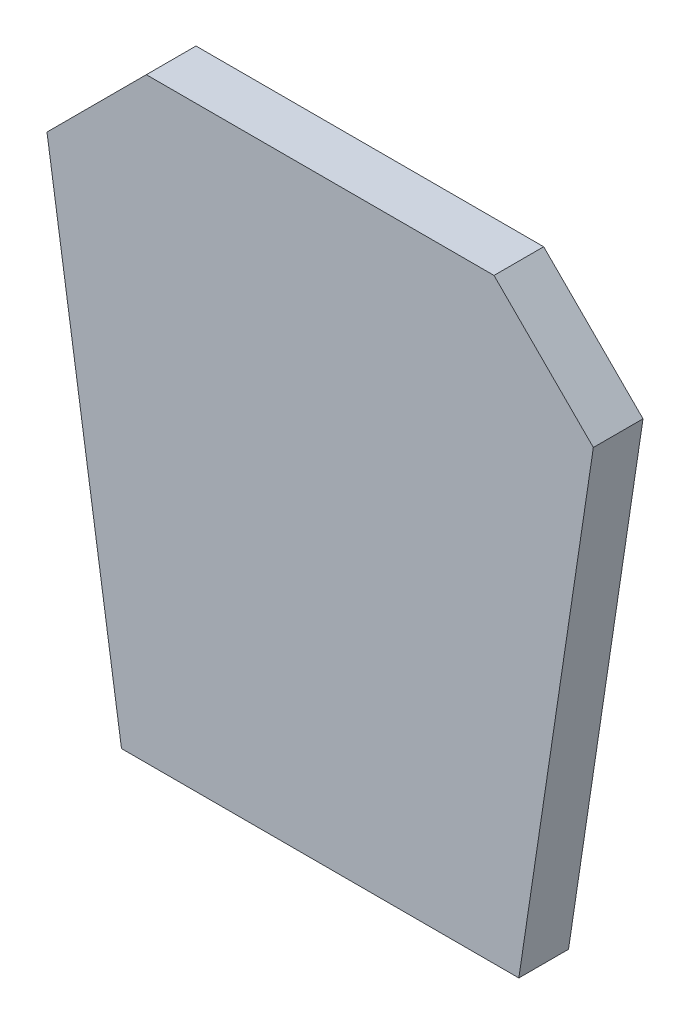
ISO-10303-21;
HEADER;
FILE_DESCRIPTION(('STEP AP214'),'2;1');
FILE_NAME('part.step','',(''),(''),'','','');
FILE_SCHEMA(('AUTOMOTIVE_DESIGN { 1 0 10303 214 1 1 1 1 }'));
ENDSEC;
DATA;
#1=APPLICATION_CONTEXT('core data for automotive mechanical design processes');
#2=APPLICATION_PROTOCOL_DEFINITION('international standard','automotive_design',2000,#1);
#3=PRODUCT_CONTEXT('',#1,'mechanical');
#4=PRODUCT('Part','Part','',(#3));
#5=PRODUCT_RELATED_PRODUCT_CATEGORY('part','',(#4));
#6=PRODUCT_DEFINITION_FORMATION('','',#4);
#7=PRODUCT_DEFINITION_CONTEXT('part definition',#1,'design');
#8=PRODUCT_DEFINITION('design','',#6,#7);
#9=PRODUCT_DEFINITION_SHAPE('','',#8);
#10=(LENGTH_UNIT() NAMED_UNIT(*) SI_UNIT(.MILLI.,.METRE.));
#11=(NAMED_UNIT(*) PLANE_ANGLE_UNIT() SI_UNIT($,.RADIAN.));
#12=(NAMED_UNIT(*) SI_UNIT($,.STERADIAN.) SOLID_ANGLE_UNIT());
#13=UNCERTAINTY_MEASURE_WITH_UNIT(LENGTH_MEASURE(1.E-05),#10,'distance_accuracy_value','');
#14=(GEOMETRIC_REPRESENTATION_CONTEXT(3) GLOBAL_UNCERTAINTY_ASSIGNED_CONTEXT((#13)) GLOBAL_UNIT_ASSIGNED_CONTEXT((#10,
#11,#12)) REPRESENTATION_CONTEXT('',''));
#15=CARTESIAN_POINT('',(0.,0.,0.));
#16=DIRECTION('',(0.,0.,1.));
#17=DIRECTION('',(1.,0.,0.));
#18=AXIS2_PLACEMENT_3D('',#15,#16,#17);
#19=CARTESIAN_POINT('',(-200.,0.,50.));
#20=DIRECTION('',(0.988936352868298,0.148340452930245,0.));
#21=DIRECTION('',(-0.148340452930245,0.988936352868298,0.));
#22=AXIS2_PLACEMENT_3D('',#19,#20,#21);
#23=PLANE('',#22);
#24=DIRECTION('',(0.148340452930245,-0.988936352868298,0.));
#25=VECTOR('',#24,1.);
#26=CARTESIAN_POINT('',(-200.,0.,0.));
#27=LINE('',#26,#25);
#28=CARTESIAN_POINT('',(-275.,500.,0.));
#29=VERTEX_POINT('',#28);
#30=CARTESIAN_POINT('',(-200.,0.,0.));
#31=VERTEX_POINT('',#30);
#32=EDGE_CURVE('E134',#29,#31,#27,.T.);
#33=ORIENTED_EDGE('',*,*,#32,.T.);
#34=DIRECTION('',(0.,0.,-1.));
#35=VECTOR('',#34,1.);
#36=CARTESIAN_POINT('',(-200.,0.,50.));
#37=LINE('',#36,#35);
#38=CARTESIAN_POINT('',(-200.,0.,50.));
#39=VERTEX_POINT('',#38);
#40=EDGE_CURVE('E11',#39,#31,#37,.T.);
#41=ORIENTED_EDGE('',*,*,#40,.F.);
#42=DIRECTION('',(0.148340452930245,-0.988936352868298,0.));
#43=VECTOR('',#42,1.);
#44=CARTESIAN_POINT('',(-200.,0.,50.));
#45=LINE('',#44,#43);
#46=CARTESIAN_POINT('',(-275.,500.,50.));
#47=VERTEX_POINT('',#46);
#48=EDGE_CURVE('E150',#47,#39,#45,.T.);
#49=ORIENTED_EDGE('',*,*,#48,.F.);
#50=DIRECTION('',(0.,0.,-1.));
#51=VECTOR('',#50,1.);
#52=CARTESIAN_POINT('',(-275.,500.,50.));
#53=LINE('',#52,#51);
#54=EDGE_CURVE('E130',#47,#29,#53,.T.);
#55=ORIENTED_EDGE('',*,*,#54,.T.);
#56=EDGE_LOOP('',(#33,#41,#49,#55));
#57=FACE_BOUND('',#56,.T.);
#58=ADVANCED_FACE('F45',(#57),#23,.F.);
#59=CARTESIAN_POINT('',(200.,0.,50.));
#60=DIRECTION('',(0.,1.,0.));
#61=DIRECTION('',(0.,0.,1.));
#62=AXIS2_PLACEMENT_3D('',#59,#60,#61);
#63=PLANE('',#62);
#64=DIRECTION('',(1.,0.,0.));
#65=VECTOR('',#64,1.);
#66=CARTESIAN_POINT('',(200.,0.,0.));
#67=LINE('',#66,#65);
#68=CARTESIAN_POINT('',(200.,0.,0.));
#69=VERTEX_POINT('',#68);
#70=EDGE_CURVE('E138',#31,#69,#67,.T.);
#71=ORIENTED_EDGE('',*,*,#70,.T.);
#72=DIRECTION('',(0.,0.,-1.));
#73=VECTOR('',#72,1.);
#74=CARTESIAN_POINT('',(200.,0.,50.));
#75=LINE('',#74,#73);
#76=CARTESIAN_POINT('',(200.,0.,50.));
#77=VERTEX_POINT('',#76);
#78=EDGE_CURVE('E54',#77,#69,#75,.T.);
#79=ORIENTED_EDGE('',*,*,#78,.F.);
#80=DIRECTION('',(1.,0.,0.));
#81=VECTOR('',#80,1.);
#82=CARTESIAN_POINT('',(200.,0.,50.));
#83=LINE('',#82,#81);
#84=EDGE_CURVE('E98',#39,#77,#83,.T.);
#85=ORIENTED_EDGE('',*,*,#84,.F.);
#86=ORIENTED_EDGE('',*,*,#40,.T.);
#87=EDGE_LOOP('',(#71,#79,#85,#86));
#88=FACE_BOUND('',#87,.T.);
#89=ADVANCED_FACE('F178',(#88),#63,.F.);
#90=CARTESIAN_POINT('',(200.,0.,50.));
#91=DIRECTION('',(-0.988936352868298,0.148340452930245,0.));
#92=DIRECTION('',(-0.148340452930245,-0.988936352868298,0.));
#93=AXIS2_PLACEMENT_3D('',#90,#91,#92);
#94=PLANE('',#93);
#95=DIRECTION('',(0.148340452930245,0.988936352868298,0.));
#96=VECTOR('',#95,1.);
#97=CARTESIAN_POINT('',(200.,0.,0.));
#98=LINE('',#97,#96);
#99=CARTESIAN_POINT('',(275.,500.,0.));
#100=VERTEX_POINT('',#99);
#101=EDGE_CURVE('E141',#69,#100,#98,.T.);
#102=ORIENTED_EDGE('',*,*,#101,.T.);
#103=DIRECTION('',(0.,0.,-1.));
#104=VECTOR('',#103,1.);
#105=CARTESIAN_POINT('',(275.,500.,50.));
#106=LINE('',#105,#104);
#107=CARTESIAN_POINT('',(275.,500.,50.));
#108=VERTEX_POINT('',#107);
#109=EDGE_CURVE('E123',#108,#100,#106,.T.);
#110=ORIENTED_EDGE('',*,*,#109,.F.);
#111=DIRECTION('',(0.148340452930245,0.988936352868298,0.));
#112=VECTOR('',#111,1.);
#113=CARTESIAN_POINT('',(200.,0.,50.));
#114=LINE('',#113,#112);
#115=EDGE_CURVE('E111',#77,#108,#114,.T.);
#116=ORIENTED_EDGE('',*,*,#115,.F.);
#117=ORIENTED_EDGE('',*,*,#78,.T.);
#118=EDGE_LOOP('',(#102,#110,#116,#117));
#119=FACE_BOUND('',#118,.T.);
#120=ADVANCED_FACE('F160',(#119),#94,.F.);
#121=CARTESIAN_POINT('',(275.,500.,50.));
#122=DIRECTION('',(-0.707106781186547,-0.707106781186547,0.));
#123=DIRECTION('',(0.707106781186548,-0.707106781186548,0.));
#124=AXIS2_PLACEMENT_3D('',#121,#122,#123);
#125=PLANE('',#124);
#126=DIRECTION('',(-0.707106781186547,0.707106781186547,0.));
#127=VECTOR('',#126,1.);
#128=CARTESIAN_POINT('',(275.,500.,0.));
#129=LINE('',#128,#127);
#130=CARTESIAN_POINT('',(175.,600.,0.));
#131=VERTEX_POINT('',#130);
#132=EDGE_CURVE('E121',#100,#131,#129,.T.);
#133=ORIENTED_EDGE('',*,*,#132,.T.);
#134=DIRECTION('',(0.,0.,-1.));
#135=VECTOR('',#134,1.);
#136=CARTESIAN_POINT('',(175.,600.,50.));
#137=LINE('',#136,#135);
#138=CARTESIAN_POINT('',(175.,600.,50.));
#139=VERTEX_POINT('',#138);
#140=EDGE_CURVE('E118',#139,#131,#137,.T.);
#141=ORIENTED_EDGE('',*,*,#140,.F.);
#142=DIRECTION('',(-0.707106781186547,0.707106781186547,0.));
#143=VECTOR('',#142,1.);
#144=CARTESIAN_POINT('',(275.,500.,50.));
#145=LINE('',#144,#143);
#146=EDGE_CURVE('E105',#108,#139,#145,.T.);
#147=ORIENTED_EDGE('',*,*,#146,.F.);
#148=ORIENTED_EDGE('',*,*,#109,.T.);
#149=EDGE_LOOP('',(#133,#141,#147,#148));
#150=FACE_BOUND('',#149,.T.);
#151=ADVANCED_FACE('F119',(#150),#125,.F.);
#152=CARTESIAN_POINT('',(-175.,600.,50.));
#153=DIRECTION('',(0.,-1.,0.));
#154=DIRECTION('',(0.,0.,-1.));
#155=AXIS2_PLACEMENT_3D('',#152,#153,#154);
#156=PLANE('',#155);
#157=DIRECTION('',(-1.,0.,0.));
#158=VECTOR('',#157,1.);
#159=CARTESIAN_POINT('',(-175.,600.,0.));
#160=LINE('',#159,#158);
#161=CARTESIAN_POINT('',(-175.,600.,0.));
#162=VERTEX_POINT('',#161);
#163=EDGE_CURVE('E84',#131,#162,#160,.T.);
#164=ORIENTED_EDGE('',*,*,#163,.T.);
#165=DIRECTION('',(0.,0.,-1.));
#166=VECTOR('',#165,1.);
#167=CARTESIAN_POINT('',(-175.,600.,50.));
#168=LINE('',#167,#166);
#169=CARTESIAN_POINT('',(-175.,600.,50.));
#170=VERTEX_POINT('',#169);
#171=EDGE_CURVE('E124',#170,#162,#168,.T.);
#172=ORIENTED_EDGE('',*,*,#171,.F.);
#173=DIRECTION('',(-1.,0.,0.));
#174=VECTOR('',#173,1.);
#175=CARTESIAN_POINT('',(175.,600.,50.));
#176=LINE('',#175,#174);
#177=EDGE_CURVE('E109',#139,#170,#176,.T.);
#178=ORIENTED_EDGE('',*,*,#177,.F.);
#179=ORIENTED_EDGE('',*,*,#140,.T.);
#180=EDGE_LOOP('',(#164,#172,#178,#179));
#181=FACE_BOUND('',#180,.T.);
#182=ADVANCED_FACE('F126',(#181),#156,.F.);
#183=CARTESIAN_POINT('',(-275.,500.,50.));
#184=DIRECTION('',(0.707106781186547,-0.707106781186547,0.));
#185=DIRECTION('',(0.707106781186548,0.707106781186548,0.));
#186=AXIS2_PLACEMENT_3D('',#183,#184,#185);
#187=PLANE('',#186);
#188=DIRECTION('',(-0.707106781186547,-0.707106781186547,0.));
#189=VECTOR('',#188,1.);
#190=CARTESIAN_POINT('',(-275.,500.,0.));
#191=LINE('',#190,#189);
#192=EDGE_CURVE('E90',#162,#29,#191,.T.);
#193=ORIENTED_EDGE('',*,*,#192,.T.);
#194=ORIENTED_EDGE('',*,*,#54,.F.);
#195=DIRECTION('',(-0.707106781186547,-0.707106781186547,0.));
#196=VECTOR('',#195,1.);
#197=CARTESIAN_POINT('',(-275.,500.,50.));
#198=LINE('',#197,#196);
#199=EDGE_CURVE('E62',#170,#47,#198,.T.);
#200=ORIENTED_EDGE('',*,*,#199,.F.);
#201=ORIENTED_EDGE('',*,*,#171,.T.);
#202=EDGE_LOOP('',(#193,#194,#200,#201));
#203=FACE_BOUND('',#202,.T.);
#204=ADVANCED_FACE('F167',(#203),#187,.F.);
#205=CARTESIAN_POINT('',(0.,0.,50.));
#206=DIRECTION('',(0.,0.,-1.));
#207=DIRECTION('',(-1.,0.,0.));
#208=AXIS2_PLACEMENT_3D('',#205,#206,#207);
#209=PLANE('',#208);
#210=ORIENTED_EDGE('',*,*,#48,.T.);
#211=ORIENTED_EDGE('',*,*,#84,.T.);
#212=ORIENTED_EDGE('',*,*,#115,.T.);
#213=ORIENTED_EDGE('',*,*,#146,.T.);
#214=ORIENTED_EDGE('',*,*,#177,.T.);
#215=ORIENTED_EDGE('',*,*,#199,.T.);
#216=EDGE_LOOP('',(#210,#211,#212,#213,#214,#215));
#217=FACE_BOUND('',#216,.T.);
#218=ADVANCED_FACE('F107',(#217),#209,.F.);
#219=CARTESIAN_POINT('',(0.,0.,0.));
#220=DIRECTION('',(0.,0.,-1.));
#221=DIRECTION('',(-1.,0.,0.));
#222=AXIS2_PLACEMENT_3D('',#219,#220,#221);
#223=PLANE('',#222);
#224=ORIENTED_EDGE('',*,*,#32,.F.);
#225=ORIENTED_EDGE('',*,*,#192,.F.);
#226=ORIENTED_EDGE('',*,*,#163,.F.);
#227=ORIENTED_EDGE('',*,*,#132,.F.);
#228=ORIENTED_EDGE('',*,*,#101,.F.);
#229=ORIENTED_EDGE('',*,*,#70,.F.);
#230=EDGE_LOOP('',(#224,#225,#226,#227,#228,#229));
#231=FACE_BOUND('',#230,.T.);
#232=ADVANCED_FACE('F163',(#231),#223,.T.);
#233=CLOSED_SHELL('',(#58,#89,#120,#151,#182,#204,#218,#232));
#234=MANIFOLD_SOLID_BREP('B2',#233);
#235=ADVANCED_BREP_SHAPE_REPRESENTATION('',(#18,#234),#14);
#236=SHAPE_DEFINITION_REPRESENTATION(#9,#235);
ENDSEC;
END-ISO-10303-21;
